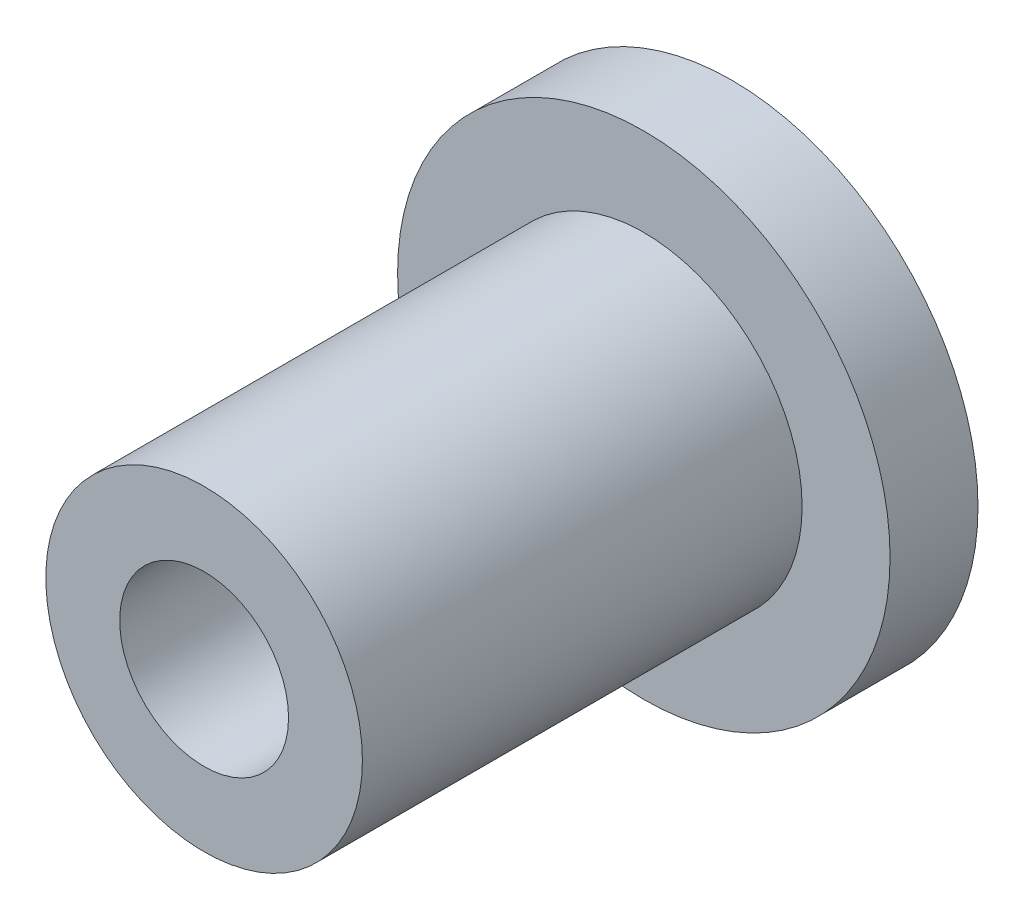
ISO-10303-21;
HEADER;
FILE_DESCRIPTION(('STEP AP214'),'2;1');
FILE_NAME('part.step','',(''),(''),'','','');
FILE_SCHEMA(('AUTOMOTIVE_DESIGN { 1 0 10303 214 1 1 1 1 }'));
ENDSEC;
DATA;
#1=APPLICATION_CONTEXT('core data for automotive mechanical design processes');
#2=APPLICATION_PROTOCOL_DEFINITION('international standard','automotive_design',2000,#1);
#3=PRODUCT_CONTEXT('',#1,'mechanical');
#4=PRODUCT('Part','Part','',(#3));
#5=PRODUCT_RELATED_PRODUCT_CATEGORY('part','',(#4));
#6=PRODUCT_DEFINITION_FORMATION('','',#4);
#7=PRODUCT_DEFINITION_CONTEXT('part definition',#1,'design');
#8=PRODUCT_DEFINITION('design','',#6,#7);
#9=PRODUCT_DEFINITION_SHAPE('','',#8);
#10=(LENGTH_UNIT() NAMED_UNIT(*) SI_UNIT(.MILLI.,.METRE.));
#11=(NAMED_UNIT(*) PLANE_ANGLE_UNIT() SI_UNIT($,.RADIAN.));
#12=(NAMED_UNIT(*) SI_UNIT($,.STERADIAN.) SOLID_ANGLE_UNIT());
#13=UNCERTAINTY_MEASURE_WITH_UNIT(LENGTH_MEASURE(1.E-05),#10,'distance_accuracy_value','');
#14=(GEOMETRIC_REPRESENTATION_CONTEXT(3) GLOBAL_UNCERTAINTY_ASSIGNED_CONTEXT((#13)) GLOBAL_UNIT_ASSIGNED_CONTEXT((#10,
#11,#12)) REPRESENTATION_CONTEXT('',''));
#15=CARTESIAN_POINT('',(0.,0.,0.));
#16=DIRECTION('',(0.,0.,1.));
#17=DIRECTION('',(1.,0.,0.));
#18=AXIS2_PLACEMENT_3D('',#15,#16,#17);
#19=CARTESIAN_POINT('',(0.,0.,2.5));
#20=DIRECTION('',(0.,0.,-1.));
#21=DIRECTION('',(-1.,0.,0.));
#22=AXIS2_PLACEMENT_3D('',#19,#20,#21);
#23=CYLINDRICAL_SURFACE('',#22,7.);
#24=CARTESIAN_POINT('',(0.,0.,2.5));
#25=DIRECTION('',(0.,0.,1.));
#26=DIRECTION('',(1.,0.,0.));
#27=AXIS2_PLACEMENT_3D('',#24,#25,#26);
#28=CIRCLE('',#27,7.);
#29=CARTESIAN_POINT('',(7.,0.,2.5));
#30=VERTEX_POINT('',#29);
#31=EDGE_CURVE('E45',#30,#30,#28,.T.);
#32=ORIENTED_EDGE('',*,*,#31,.F.);
#33=EDGE_LOOP('',(#32));
#34=FACE_BOUND('',#33,.T.);
#35=CARTESIAN_POINT('',(0.,0.,0.));
#36=DIRECTION('',(0.,0.,1.));
#37=DIRECTION('',(1.,0.,0.));
#38=AXIS2_PLACEMENT_3D('',#35,#36,#37);
#39=CIRCLE('',#38,7.);
#40=CARTESIAN_POINT('',(7.,0.,0.));
#41=VERTEX_POINT('',#40);
#42=EDGE_CURVE('E40',#41,#41,#39,.T.);
#43=ORIENTED_EDGE('',*,*,#42,.T.);
#44=EDGE_LOOP('',(#43));
#45=FACE_BOUND('',#44,.T.);
#46=ADVANCED_FACE('F37',(#34,#45),#23,.T.);
#47=CARTESIAN_POINT('',(0.,0.,2.5));
#48=DIRECTION('',(0.,0.,1.));
#49=DIRECTION('',(1.,0.,0.));
#50=AXIS2_PLACEMENT_3D('',#47,#48,#49);
#51=PLANE('',#50);
#52=CARTESIAN_POINT('',(0.,0.,2.5));
#53=DIRECTION('',(0.,0.,1.));
#54=DIRECTION('',(1.,0.,0.));
#55=AXIS2_PLACEMENT_3D('',#52,#53,#54);
#56=CIRCLE('',#55,4.5);
#57=CARTESIAN_POINT('',(4.5,0.,2.5));
#58=VERTEX_POINT('',#57);
#59=EDGE_CURVE('E10',#58,#58,#56,.T.);
#60=ORIENTED_EDGE('',*,*,#59,.F.);
#61=EDGE_LOOP('',(#60));
#62=FACE_BOUND('',#61,.T.);
#63=ORIENTED_EDGE('',*,*,#31,.T.);
#64=EDGE_LOOP('',(#63));
#65=FACE_BOUND('',#64,.T.);
#66=ADVANCED_FACE('F86',(#62,#65),#51,.T.);
#67=CARTESIAN_POINT('',(0.,0.,0.));
#68=DIRECTION('',(0.,0.,1.));
#69=DIRECTION('',(1.,0.,0.));
#70=AXIS2_PLACEMENT_3D('',#67,#68,#69);
#71=PLANE('',#70);
#72=ORIENTED_EDGE('',*,*,#42,.F.);
#73=EDGE_LOOP('',(#72));
#74=FACE_BOUND('',#73,.T.);
#75=ADVANCED_FACE('F81',(#74),#71,.F.);
#76=CARTESIAN_POINT('',(0.,0.,15.));
#77=DIRECTION('',(0.,0.,-1.));
#78=DIRECTION('',(-1.,0.,0.));
#79=AXIS2_PLACEMENT_3D('',#76,#77,#78);
#80=CYLINDRICAL_SURFACE('',#79,4.5);
#81=CARTESIAN_POINT('',(0.,0.,15.));
#82=DIRECTION('',(0.,0.,1.));
#83=DIRECTION('',(1.,0.,0.));
#84=AXIS2_PLACEMENT_3D('',#81,#82,#83);
#85=CIRCLE('',#84,4.5);
#86=CARTESIAN_POINT('',(4.5,0.,15.));
#87=VERTEX_POINT('',#86);
#88=EDGE_CURVE('E52',#87,#87,#85,.T.);
#89=ORIENTED_EDGE('',*,*,#88,.F.);
#90=EDGE_LOOP('',(#89));
#91=FACE_BOUND('',#90,.T.);
#92=ORIENTED_EDGE('',*,*,#59,.T.);
#93=EDGE_LOOP('',(#92));
#94=FACE_BOUND('',#93,.T.);
#95=ADVANCED_FACE('F76',(#91,#94),#80,.T.);
#96=CARTESIAN_POINT('',(0.,0.,15.));
#97=DIRECTION('',(0.,0.,1.));
#98=DIRECTION('',(1.,0.,0.));
#99=AXIS2_PLACEMENT_3D('',#96,#97,#98);
#100=PLANE('',#99);
#101=CARTESIAN_POINT('',(0.,0.,15.));
#102=DIRECTION('',(0.,0.,1.));
#103=DIRECTION('',(1.,0.,0.));
#104=AXIS2_PLACEMENT_3D('',#101,#102,#103);
#105=CIRCLE('',#104,2.4);
#106=CARTESIAN_POINT('',(2.4,0.,15.));
#107=VERTEX_POINT('',#106);
#108=EDGE_CURVE('E57',#107,#107,#105,.T.);
#109=ORIENTED_EDGE('',*,*,#108,.F.);
#110=EDGE_LOOP('',(#109));
#111=FACE_BOUND('',#110,.T.);
#112=ORIENTED_EDGE('',*,*,#88,.T.);
#113=EDGE_LOOP('',(#112));
#114=FACE_BOUND('',#113,.T.);
#115=ADVANCED_FACE('F70',(#111,#114),#100,.T.);
#116=CARTESIAN_POINT('',(0.,0.,10.));
#117=DIRECTION('',(0.,0.,1.));
#118=DIRECTION('',(1.,0.,0.));
#119=AXIS2_PLACEMENT_3D('',#116,#117,#118);
#120=CYLINDRICAL_SURFACE('',#119,2.4);
#121=CARTESIAN_POINT('',(0.,0.,10.));
#122=DIRECTION('',(0.,0.,1.));
#123=DIRECTION('',(1.,0.,0.));
#124=AXIS2_PLACEMENT_3D('',#121,#122,#123);
#125=CIRCLE('',#124,2.4);
#126=CARTESIAN_POINT('',(2.4,0.,10.));
#127=VERTEX_POINT('',#126);
#128=EDGE_CURVE('E56',#127,#127,#125,.T.);
#129=ORIENTED_EDGE('',*,*,#128,.F.);
#130=EDGE_LOOP('',(#129));
#131=FACE_BOUND('',#130,.T.);
#132=ORIENTED_EDGE('',*,*,#108,.T.);
#133=EDGE_LOOP('',(#132));
#134=FACE_BOUND('',#133,.T.);
#135=ADVANCED_FACE('F67',(#131,#134),#120,.F.);
#136=CARTESIAN_POINT('',(0.,0.,10.));
#137=DIRECTION('',(0.,0.,1.));
#138=DIRECTION('',(1.,0.,0.));
#139=AXIS2_PLACEMENT_3D('',#136,#137,#138);
#140=PLANE('',#139);
#141=ORIENTED_EDGE('',*,*,#128,.T.);
#142=EDGE_LOOP('',(#141));
#143=FACE_BOUND('',#142,.T.);
#144=ADVANCED_FACE('F65',(#143),#140,.T.);
#145=CLOSED_SHELL('',(#46,#66,#75,#95,#115,#135,#144));
#146=MANIFOLD_SOLID_BREP('B2',#145);
#147=ADVANCED_BREP_SHAPE_REPRESENTATION('',(#18,#146),#14);
#148=SHAPE_DEFINITION_REPRESENTATION(#9,#147);
ENDSEC;
END-ISO-10303-21;
